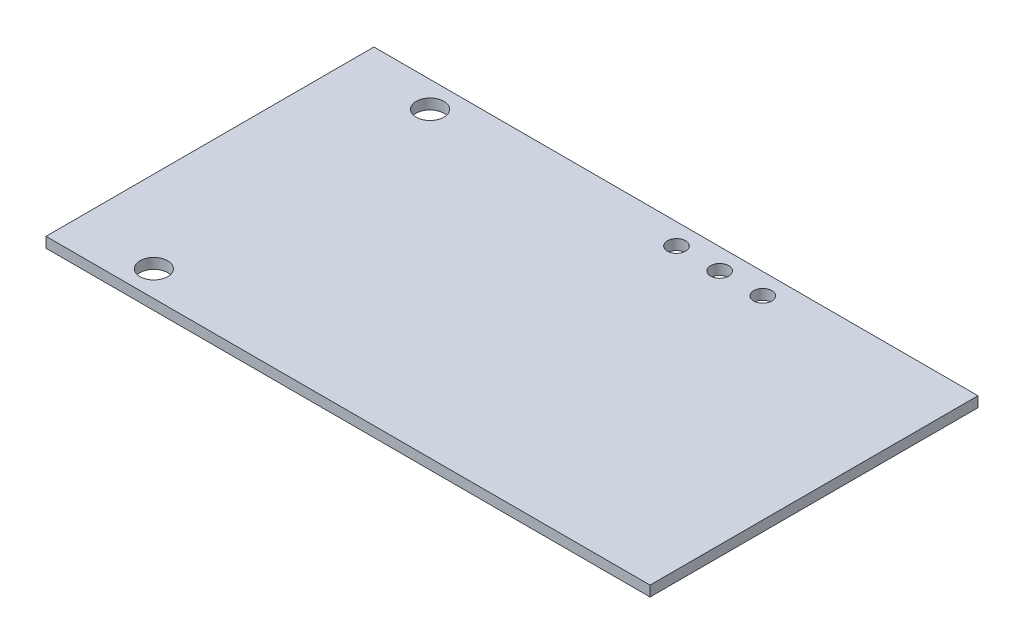
ISO-10303-21;
HEADER;
FILE_DESCRIPTION(('STEP AP214'),'2;1');
FILE_NAME('part.step','',(''),(''),'','','');
FILE_SCHEMA(('AUTOMOTIVE_DESIGN { 1 0 10303 214 1 1 1 1 }'));
ENDSEC;
DATA;
#1=APPLICATION_CONTEXT('core data for automotive mechanical design processes');
#2=APPLICATION_PROTOCOL_DEFINITION('international standard','automotive_design',2000,#1);
#3=PRODUCT_CONTEXT('',#1,'mechanical');
#4=PRODUCT('Part','Part','',(#3));
#5=PRODUCT_RELATED_PRODUCT_CATEGORY('part','',(#4));
#6=PRODUCT_DEFINITION_FORMATION('','',#4);
#7=PRODUCT_DEFINITION_CONTEXT('part definition',#1,'design');
#8=PRODUCT_DEFINITION('design','',#6,#7);
#9=PRODUCT_DEFINITION_SHAPE('','',#8);
#10=(LENGTH_UNIT() NAMED_UNIT(*) SI_UNIT(.MILLI.,.METRE.));
#11=(NAMED_UNIT(*) PLANE_ANGLE_UNIT() SI_UNIT($,.RADIAN.));
#12=(NAMED_UNIT(*) SI_UNIT($,.STERADIAN.) SOLID_ANGLE_UNIT());
#13=UNCERTAINTY_MEASURE_WITH_UNIT(LENGTH_MEASURE(1.E-05),#10,'distance_accuracy_value','');
#14=(GEOMETRIC_REPRESENTATION_CONTEXT(3) GLOBAL_UNCERTAINTY_ASSIGNED_CONTEXT((#13)) GLOBAL_UNIT_ASSIGNED_CONTEXT((#10,
#11,#12)) REPRESENTATION_CONTEXT('',''));
#15=CARTESIAN_POINT('',(0.,0.,0.));
#16=DIRECTION('',(0.,0.,1.));
#17=DIRECTION('',(1.,0.,0.));
#18=AXIS2_PLACEMENT_3D('',#15,#16,#17);
#19=CARTESIAN_POINT('',(-35.,1.2,19.));
#20=DIRECTION('',(1.,0.,0.));
#21=DIRECTION('',(0.,0.,-1.));
#22=AXIS2_PLACEMENT_3D('',#19,#20,#21);
#23=PLANE('',#22);
#24=DIRECTION('',(0.,0.,1.));
#25=VECTOR('',#24,1.);
#26=CARTESIAN_POINT('',(-35.,0.,19.));
#27=LINE('',#26,#25);
#28=CARTESIAN_POINT('',(-35.,0.,-19.));
#29=VERTEX_POINT('',#28);
#30=CARTESIAN_POINT('',(-35.,0.,19.));
#31=VERTEX_POINT('',#30);
#32=EDGE_CURVE('E96',#29,#31,#27,.T.);
#33=ORIENTED_EDGE('',*,*,#32,.T.);
#34=DIRECTION('',(0.,-1.,0.));
#35=VECTOR('',#34,1.);
#36=CARTESIAN_POINT('',(-35.,1.2,19.));
#37=LINE('',#36,#35);
#38=CARTESIAN_POINT('',(-35.,1.2,19.));
#39=VERTEX_POINT('',#38);
#40=EDGE_CURVE('E11',#39,#31,#37,.T.);
#41=ORIENTED_EDGE('',*,*,#40,.F.);
#42=DIRECTION('',(0.,0.,1.));
#43=VECTOR('',#42,1.);
#44=CARTESIAN_POINT('',(-35.,1.2,19.));
#45=LINE('',#44,#43);
#46=CARTESIAN_POINT('',(-35.,1.2,-19.));
#47=VERTEX_POINT('',#46);
#48=EDGE_CURVE('E84',#47,#39,#45,.T.);
#49=ORIENTED_EDGE('',*,*,#48,.F.);
#50=DIRECTION('',(0.,-1.,0.));
#51=VECTOR('',#50,1.);
#52=CARTESIAN_POINT('',(-35.,1.2,-19.));
#53=LINE('',#52,#51);
#54=EDGE_CURVE('E92',#47,#29,#53,.T.);
#55=ORIENTED_EDGE('',*,*,#54,.T.);
#56=EDGE_LOOP('',(#33,#41,#49,#55));
#57=FACE_BOUND('',#56,.T.);
#58=ADVANCED_FACE('F33',(#57),#23,.F.);
#59=CARTESIAN_POINT('',(35.,1.2,19.));
#60=DIRECTION('',(0.,0.,-1.));
#61=DIRECTION('',(-1.,0.,0.));
#62=AXIS2_PLACEMENT_3D('',#59,#60,#61);
#63=PLANE('',#62);
#64=DIRECTION('',(1.,0.,0.));
#65=VECTOR('',#64,1.);
#66=CARTESIAN_POINT('',(35.,0.,19.));
#67=LINE('',#66,#65);
#68=CARTESIAN_POINT('',(35.,0.,19.));
#69=VERTEX_POINT('',#68);
#70=EDGE_CURVE('E88',#31,#69,#67,.T.);
#71=ORIENTED_EDGE('',*,*,#70,.T.);
#72=DIRECTION('',(0.,-1.,0.));
#73=VECTOR('',#72,1.);
#74=CARTESIAN_POINT('',(35.,1.2,19.));
#75=LINE('',#74,#73);
#76=CARTESIAN_POINT('',(35.,1.2,19.));
#77=VERTEX_POINT('',#76);
#78=EDGE_CURVE('E41',#77,#69,#75,.T.);
#79=ORIENTED_EDGE('',*,*,#78,.F.);
#80=DIRECTION('',(1.,0.,0.));
#81=VECTOR('',#80,1.);
#82=CARTESIAN_POINT('',(35.,1.2,19.));
#83=LINE('',#82,#81);
#84=EDGE_CURVE('E79',#39,#77,#83,.T.);
#85=ORIENTED_EDGE('',*,*,#84,.F.);
#86=ORIENTED_EDGE('',*,*,#40,.T.);
#87=EDGE_LOOP('',(#71,#79,#85,#86));
#88=FACE_BOUND('',#87,.T.);
#89=ADVANCED_FACE('F87',(#88),#63,.F.);
#90=CARTESIAN_POINT('',(35.,1.2,19.));
#91=DIRECTION('',(-1.,0.,0.));
#92=DIRECTION('',(0.,0.,1.));
#93=AXIS2_PLACEMENT_3D('',#90,#91,#92);
#94=PLANE('',#93);
#95=DIRECTION('',(0.,0.,-1.));
#96=VECTOR('',#95,1.);
#97=CARTESIAN_POINT('',(35.,0.,19.));
#98=LINE('',#97,#96);
#99=CARTESIAN_POINT('',(35.,0.,-19.));
#100=VERTEX_POINT('',#99);
#101=EDGE_CURVE('E66',#69,#100,#98,.T.);
#102=ORIENTED_EDGE('',*,*,#101,.T.);
#103=DIRECTION('',(0.,-1.,0.));
#104=VECTOR('',#103,1.);
#105=CARTESIAN_POINT('',(35.,1.2,-19.));
#106=LINE('',#105,#104);
#107=CARTESIAN_POINT('',(35.,1.2,-19.));
#108=VERTEX_POINT('',#107);
#109=EDGE_CURVE('E89',#108,#100,#106,.T.);
#110=ORIENTED_EDGE('',*,*,#109,.F.);
#111=DIRECTION('',(0.,0.,-1.));
#112=VECTOR('',#111,1.);
#113=CARTESIAN_POINT('',(35.,1.2,19.));
#114=LINE('',#113,#112);
#115=EDGE_CURVE('E82',#77,#108,#114,.T.);
#116=ORIENTED_EDGE('',*,*,#115,.F.);
#117=ORIENTED_EDGE('',*,*,#78,.T.);
#118=EDGE_LOOP('',(#102,#110,#116,#117));
#119=FACE_BOUND('',#118,.T.);
#120=ADVANCED_FACE('F90',(#119),#94,.F.);
#121=CARTESIAN_POINT('',(35.,1.2,-19.));
#122=DIRECTION('',(0.,0.,1.));
#123=DIRECTION('',(1.,0.,0.));
#124=AXIS2_PLACEMENT_3D('',#121,#122,#123);
#125=PLANE('',#124);
#126=DIRECTION('',(-1.,0.,0.));
#127=VECTOR('',#126,1.);
#128=CARTESIAN_POINT('',(35.,0.,-19.));
#129=LINE('',#128,#127);
#130=EDGE_CURVE('E72',#100,#29,#129,.T.);
#131=ORIENTED_EDGE('',*,*,#130,.T.);
#132=ORIENTED_EDGE('',*,*,#54,.F.);
#133=DIRECTION('',(-1.,0.,0.));
#134=VECTOR('',#133,1.);
#135=CARTESIAN_POINT('',(35.,1.2,-19.));
#136=LINE('',#135,#134);
#137=EDGE_CURVE('E49',#108,#47,#136,.T.);
#138=ORIENTED_EDGE('',*,*,#137,.F.);
#139=ORIENTED_EDGE('',*,*,#109,.T.);
#140=EDGE_LOOP('',(#131,#132,#138,#139));
#141=FACE_BOUND('',#140,.T.);
#142=ADVANCED_FACE('F104',(#141),#125,.F.);
#143=CARTESIAN_POINT('',(-35.,1.2,-19.));
#144=DIRECTION('',(0.,1.,0.));
#145=DIRECTION('',(0.,0.,1.));
#146=AXIS2_PLACEMENT_3D('',#143,#144,#145);
#147=PLANE('',#146);
#148=CARTESIAN_POINT('',(12.5,1.2,-16.56));
#149=DIRECTION('',(0.,1.,0.));
#150=DIRECTION('',(0.,0.,1.));
#151=AXIS2_PLACEMENT_3D('',#148,#149,#150);
#152=CIRCLE('',#151,1.05);
#153=CARTESIAN_POINT('',(12.5,1.2,-15.51));
#154=VERTEX_POINT('',#153);
#155=EDGE_CURVE('E134',#154,#154,#152,.T.);
#156=ORIENTED_EDGE('',*,*,#155,.F.);
#157=EDGE_LOOP('',(#156));
#158=FACE_BOUND('',#157,.T.);
#159=CARTESIAN_POINT('',(7.50000000000001,1.2,-16.56));
#160=DIRECTION('',(0.,1.,0.));
#161=DIRECTION('',(0.,0.,1.));
#162=AXIS2_PLACEMENT_3D('',#159,#160,#161);
#163=CIRCLE('',#162,1.05);
#164=CARTESIAN_POINT('',(7.50000000000001,1.2,-15.51));
#165=VERTEX_POINT('',#164);
#166=EDGE_CURVE('E128',#165,#165,#163,.T.);
#167=ORIENTED_EDGE('',*,*,#166,.F.);
#168=EDGE_LOOP('',(#167));
#169=FACE_BOUND('',#168,.T.);
#170=CARTESIAN_POINT('',(2.5,1.2,-16.56));
#171=DIRECTION('',(0.,1.,0.));
#172=DIRECTION('',(0.,0.,1.));
#173=AXIS2_PLACEMENT_3D('',#170,#171,#172);
#174=CIRCLE('',#173,1.05);
#175=CARTESIAN_POINT('',(2.5,1.2,-15.51));
#176=VERTEX_POINT('',#175);
#177=EDGE_CURVE('E122',#176,#176,#174,.T.);
#178=ORIENTED_EDGE('',*,*,#177,.F.);
#179=EDGE_LOOP('',(#178));
#180=FACE_BOUND('',#179,.T.);
#181=CARTESIAN_POINT('',(-25.5,1.2,16.));
#182=DIRECTION('',(0.,1.,0.));
#183=DIRECTION('',(0.,0.,1.));
#184=AXIS2_PLACEMENT_3D('',#181,#182,#183);
#185=CIRCLE('',#184,1.6);
#186=CARTESIAN_POINT('',(-25.5,1.2,17.6));
#187=VERTEX_POINT('',#186);
#188=EDGE_CURVE('E116',#187,#187,#185,.T.);
#189=ORIENTED_EDGE('',*,*,#188,.F.);
#190=EDGE_LOOP('',(#189));
#191=FACE_BOUND('',#190,.T.);
#192=CARTESIAN_POINT('',(-25.5,1.2,-16.));
#193=DIRECTION('',(0.,1.,0.));
#194=DIRECTION('',(0.,0.,1.));
#195=AXIS2_PLACEMENT_3D('',#192,#193,#194);
#196=CIRCLE('',#195,1.6);
#197=CARTESIAN_POINT('',(-25.5,1.2,-14.4));
#198=VERTEX_POINT('',#197);
#199=EDGE_CURVE('E110',#198,#198,#196,.T.);
#200=ORIENTED_EDGE('',*,*,#199,.F.);
#201=EDGE_LOOP('',(#200));
#202=FACE_BOUND('',#201,.T.);
#203=ORIENTED_EDGE('',*,*,#48,.T.);
#204=ORIENTED_EDGE('',*,*,#84,.T.);
#205=ORIENTED_EDGE('',*,*,#115,.T.);
#206=ORIENTED_EDGE('',*,*,#137,.T.);
#207=EDGE_LOOP('',(#203,#204,#205,#206));
#208=FACE_BOUND('',#207,.T.);
#209=ADVANCED_FACE('F80',(#158,#169,#180,#191,#202,#208),#147,.T.);
#210=CARTESIAN_POINT('',(-35.,0.,-19.));
#211=DIRECTION('',(0.,1.,0.));
#212=DIRECTION('',(0.,0.,1.));
#213=AXIS2_PLACEMENT_3D('',#210,#211,#212);
#214=PLANE('',#213);
#215=CARTESIAN_POINT('',(12.5,0.,-16.56));
#216=DIRECTION('',(0.,1.,0.));
#217=DIRECTION('',(0.,0.,1.));
#218=AXIS2_PLACEMENT_3D('',#215,#216,#217);
#219=CIRCLE('',#218,1.05);
#220=CARTESIAN_POINT('',(12.5,0.,-15.51));
#221=VERTEX_POINT('',#220);
#222=EDGE_CURVE('E131',#221,#221,#219,.T.);
#223=ORIENTED_EDGE('',*,*,#222,.T.);
#224=EDGE_LOOP('',(#223));
#225=FACE_BOUND('',#224,.T.);
#226=CARTESIAN_POINT('',(7.50000000000001,0.,-16.56));
#227=DIRECTION('',(0.,1.,0.));
#228=DIRECTION('',(0.,0.,1.));
#229=AXIS2_PLACEMENT_3D('',#226,#227,#228);
#230=CIRCLE('',#229,1.05);
#231=CARTESIAN_POINT('',(7.50000000000001,0.,-15.51));
#232=VERTEX_POINT('',#231);
#233=EDGE_CURVE('E125',#232,#232,#230,.T.);
#234=ORIENTED_EDGE('',*,*,#233,.T.);
#235=EDGE_LOOP('',(#234));
#236=FACE_BOUND('',#235,.T.);
#237=CARTESIAN_POINT('',(2.5,0.,-16.56));
#238=DIRECTION('',(0.,1.,0.));
#239=DIRECTION('',(0.,0.,1.));
#240=AXIS2_PLACEMENT_3D('',#237,#238,#239);
#241=CIRCLE('',#240,1.05);
#242=CARTESIAN_POINT('',(2.5,0.,-15.51));
#243=VERTEX_POINT('',#242);
#244=EDGE_CURVE('E119',#243,#243,#241,.T.);
#245=ORIENTED_EDGE('',*,*,#244,.T.);
#246=EDGE_LOOP('',(#245));
#247=FACE_BOUND('',#246,.T.);
#248=CARTESIAN_POINT('',(-25.5,0.,16.));
#249=DIRECTION('',(0.,1.,0.));
#250=DIRECTION('',(0.,0.,1.));
#251=AXIS2_PLACEMENT_3D('',#248,#249,#250);
#252=CIRCLE('',#251,1.6);
#253=CARTESIAN_POINT('',(-25.5,0.,17.6));
#254=VERTEX_POINT('',#253);
#255=EDGE_CURVE('E113',#254,#254,#252,.T.);
#256=ORIENTED_EDGE('',*,*,#255,.T.);
#257=EDGE_LOOP('',(#256));
#258=FACE_BOUND('',#257,.T.);
#259=CARTESIAN_POINT('',(-25.5,0.,-16.));
#260=DIRECTION('',(0.,1.,0.));
#261=DIRECTION('',(0.,0.,1.));
#262=AXIS2_PLACEMENT_3D('',#259,#260,#261);
#263=CIRCLE('',#262,1.6);
#264=CARTESIAN_POINT('',(-25.5,0.,-14.4));
#265=VERTEX_POINT('',#264);
#266=EDGE_CURVE('E99',#265,#265,#263,.T.);
#267=ORIENTED_EDGE('',*,*,#266,.T.);
#268=EDGE_LOOP('',(#267));
#269=FACE_BOUND('',#268,.T.);
#270=ORIENTED_EDGE('',*,*,#32,.F.);
#271=ORIENTED_EDGE('',*,*,#130,.F.);
#272=ORIENTED_EDGE('',*,*,#101,.F.);
#273=ORIENTED_EDGE('',*,*,#70,.F.);
#274=EDGE_LOOP('',(#270,#271,#272,#273));
#275=FACE_BOUND('',#274,.T.);
#276=ADVANCED_FACE('F107',(#225,#236,#247,#258,#269,#275),#214,.F.);
#277=CARTESIAN_POINT('',(-25.5,0.,-16.));
#278=DIRECTION('',(0.,1.,0.));
#279=DIRECTION('',(0.,0.,1.));
#280=AXIS2_PLACEMENT_3D('',#277,#278,#279);
#281=CYLINDRICAL_SURFACE('',#280,1.6);
#282=ORIENTED_EDGE('',*,*,#266,.F.);
#283=EDGE_LOOP('',(#282));
#284=FACE_BOUND('',#283,.T.);
#285=ORIENTED_EDGE('',*,*,#199,.T.);
#286=EDGE_LOOP('',(#285));
#287=FACE_BOUND('',#286,.T.);
#288=ADVANCED_FACE('F160',(#284,#287),#281,.F.);
#289=CARTESIAN_POINT('',(-25.5,0.,16.));
#290=DIRECTION('',(0.,1.,0.));
#291=DIRECTION('',(0.,0.,1.));
#292=AXIS2_PLACEMENT_3D('',#289,#290,#291);
#293=CYLINDRICAL_SURFACE('',#292,1.6);
#294=ORIENTED_EDGE('',*,*,#255,.F.);
#295=EDGE_LOOP('',(#294));
#296=FACE_BOUND('',#295,.T.);
#297=ORIENTED_EDGE('',*,*,#188,.T.);
#298=EDGE_LOOP('',(#297));
#299=FACE_BOUND('',#298,.T.);
#300=ADVANCED_FACE('F162',(#296,#299),#293,.F.);
#301=CARTESIAN_POINT('',(2.5,0.,-16.56));
#302=DIRECTION('',(0.,1.,0.));
#303=DIRECTION('',(0.,0.,1.));
#304=AXIS2_PLACEMENT_3D('',#301,#302,#303);
#305=CYLINDRICAL_SURFACE('',#304,1.05);
#306=ORIENTED_EDGE('',*,*,#244,.F.);
#307=EDGE_LOOP('',(#306));
#308=FACE_BOUND('',#307,.T.);
#309=ORIENTED_EDGE('',*,*,#177,.T.);
#310=EDGE_LOOP('',(#309));
#311=FACE_BOUND('',#310,.T.);
#312=ADVANCED_FACE('F169',(#308,#311),#305,.F.);
#313=CARTESIAN_POINT('',(7.50000000000001,0.,-16.56));
#314=DIRECTION('',(0.,1.,0.));
#315=DIRECTION('',(0.,0.,1.));
#316=AXIS2_PLACEMENT_3D('',#313,#314,#315);
#317=CYLINDRICAL_SURFACE('',#316,1.05);
#318=ORIENTED_EDGE('',*,*,#233,.F.);
#319=EDGE_LOOP('',(#318));
#320=FACE_BOUND('',#319,.T.);
#321=ORIENTED_EDGE('',*,*,#166,.T.);
#322=EDGE_LOOP('',(#321));
#323=FACE_BOUND('',#322,.T.);
#324=ADVANCED_FACE('F145',(#320,#323),#317,.F.);
#325=CARTESIAN_POINT('',(12.5,0.,-16.56));
#326=DIRECTION('',(0.,1.,0.));
#327=DIRECTION('',(0.,0.,1.));
#328=AXIS2_PLACEMENT_3D('',#325,#326,#327);
#329=CYLINDRICAL_SURFACE('',#328,1.05);
#330=ORIENTED_EDGE('',*,*,#222,.F.);
#331=EDGE_LOOP('',(#330));
#332=FACE_BOUND('',#331,.T.);
#333=ORIENTED_EDGE('',*,*,#155,.T.);
#334=EDGE_LOOP('',(#333));
#335=FACE_BOUND('',#334,.T.);
#336=ADVANCED_FACE('F142',(#332,#335),#329,.F.);
#337=CLOSED_SHELL('',(#58,#89,#120,#142,#209,#276,#288,#300,#312,#324,#336));
#338=MANIFOLD_SOLID_BREP('B2',#337);
#339=ADVANCED_BREP_SHAPE_REPRESENTATION('',(#18,#338),#14);
#340=SHAPE_DEFINITION_REPRESENTATION(#9,#339);
ENDSEC;
END-ISO-10303-21;
